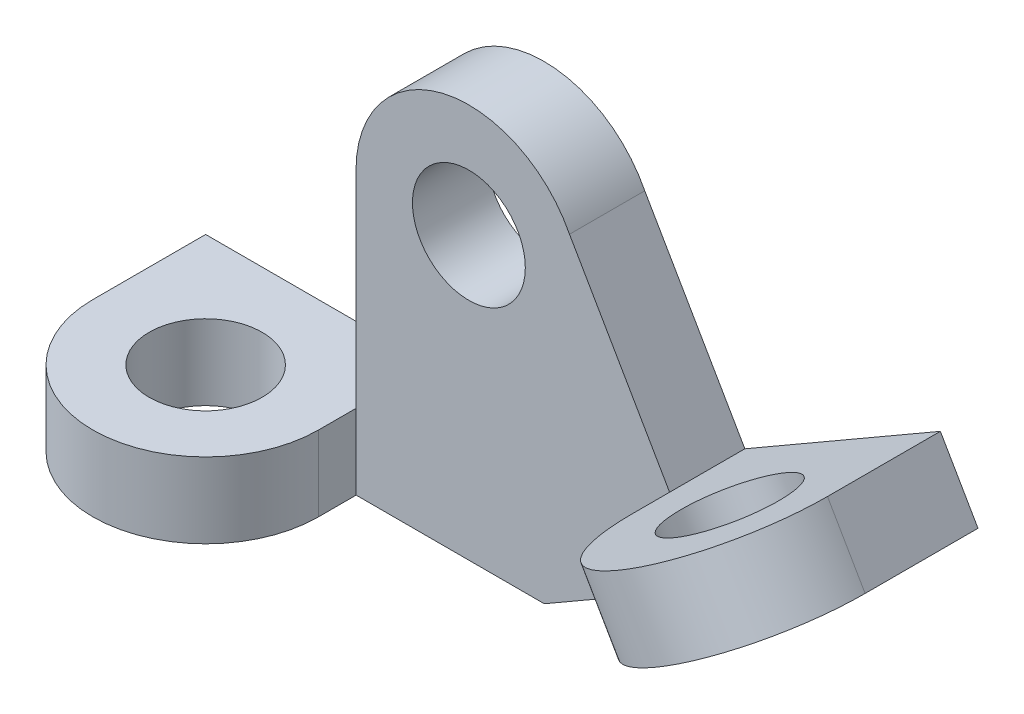
ISO-10303-21;
HEADER;
FILE_DESCRIPTION(('STEP AP214'),'2;1');
FILE_NAME('part.step','',(''),(''),'','','');
FILE_SCHEMA(('AUTOMOTIVE_DESIGN { 1 0 10303 214 1 1 1 1 }'));
ENDSEC;
DATA;
#1=APPLICATION_CONTEXT('core data for automotive mechanical design processes');
#2=APPLICATION_PROTOCOL_DEFINITION('international standard','automotive_design',2000,#1);
#3=PRODUCT_CONTEXT('',#1,'mechanical');
#4=PRODUCT('Part','Part','',(#3));
#5=PRODUCT_RELATED_PRODUCT_CATEGORY('part','',(#4));
#6=PRODUCT_DEFINITION_FORMATION('','',#4);
#7=PRODUCT_DEFINITION_CONTEXT('part definition',#1,'design');
#8=PRODUCT_DEFINITION('design','',#6,#7);
#9=PRODUCT_DEFINITION_SHAPE('','',#8);
#10=(LENGTH_UNIT() NAMED_UNIT(*) SI_UNIT(.MILLI.,.METRE.));
#11=(NAMED_UNIT(*) PLANE_ANGLE_UNIT() SI_UNIT($,.RADIAN.));
#12=(NAMED_UNIT(*) SI_UNIT($,.STERADIAN.) SOLID_ANGLE_UNIT());
#13=UNCERTAINTY_MEASURE_WITH_UNIT(LENGTH_MEASURE(1.E-05),#10,'distance_accuracy_value','');
#14=(GEOMETRIC_REPRESENTATION_CONTEXT(3) GLOBAL_UNCERTAINTY_ASSIGNED_CONTEXT((#13)) GLOBAL_UNIT_ASSIGNED_CONTEXT((#10,
#11,#12)) REPRESENTATION_CONTEXT('',''));
#15=CARTESIAN_POINT('',(0.,0.,0.));
#16=DIRECTION('',(0.,0.,1.));
#17=DIRECTION('',(1.,0.,0.));
#18=AXIS2_PLACEMENT_3D('',#15,#16,#17);
#19=CARTESIAN_POINT('',(75.,0.,75.));
#20=DIRECTION('',(0.,1.,0.));
#21=DIRECTION('',(0.,0.,1.));
#22=AXIS2_PLACEMENT_3D('',#19,#20,#21);
#23=CYLINDRICAL_SURFACE('',#22,75.);
#24=DIRECTION('',(0.,1.,0.));
#25=VECTOR('',#24,1.);
#26=CARTESIAN_POINT('',(0.,0.,75.));
#27=LINE('',#26,#25);
#28=CARTESIAN_POINT('',(0.,0.,75.));
#29=VERTEX_POINT('',#28);
#30=CARTESIAN_POINT('',(0.,50.,75.));
#31=VERTEX_POINT('',#30);
#32=EDGE_CURVE('E227',#29,#31,#27,.T.);
#33=ORIENTED_EDGE('',*,*,#32,.F.);
#34=CARTESIAN_POINT('',(75.,0.,75.));
#35=DIRECTION('',(0.,1.,0.));
#36=DIRECTION('',(0.,0.,1.));
#37=AXIS2_PLACEMENT_3D('',#34,#35,#36);
#38=CIRCLE('',#37,75.);
#39=CARTESIAN_POINT('',(150.,0.,75.));
#40=VERTEX_POINT('',#39);
#41=EDGE_CURVE('E43',#40,#29,#38,.F.);
#42=ORIENTED_EDGE('',*,*,#41,.F.);
#43=DIRECTION('',(0.,-1.,0.));
#44=VECTOR('',#43,1.);
#45=CARTESIAN_POINT('',(150.,0.,75.));
#46=LINE('',#45,#44);
#47=CARTESIAN_POINT('',(150.,50.,75.));
#48=VERTEX_POINT('',#47);
#49=EDGE_CURVE('E230',#48,#40,#46,.T.);
#50=ORIENTED_EDGE('',*,*,#49,.F.);
#51=CARTESIAN_POINT('',(75.,50.,75.));
#52=DIRECTION('',(0.,1.,0.));
#53=DIRECTION('',(0.,0.,1.));
#54=AXIS2_PLACEMENT_3D('',#51,#52,#53);
#55=CIRCLE('',#54,75.);
#56=EDGE_CURVE('E11',#31,#48,#55,.T.);
#57=ORIENTED_EDGE('',*,*,#56,.F.);
#58=EDGE_LOOP('',(#33,#42,#50,#57));
#59=FACE_BOUND('',#58,.T.);
#60=ADVANCED_FACE('F35',(#59),#23,.T.);
#61=CARTESIAN_POINT('',(423.205080756888,143.301270189222,75.0000000000001));
#62=DIRECTION('',(-0.500000000000002,0.866025403784438,0.));
#63=DIRECTION('',(-0.866025403784438,-0.500000000000002,0.));
#64=AXIS2_PLACEMENT_3D('',#61,#62,#63);
#65=CYLINDRICAL_SURFACE('',#64,74.9999999999999);
#66=DIRECTION('',(0.500000000000002,-0.866025403784438,0.));
#67=VECTOR('',#66,1.);
#68=CARTESIAN_POINT('',(488.15698604072,180.801270189222,75.0000000000001));
#69=LINE('',#68,#67);
#70=CARTESIAN_POINT('',(488.15698604072,180.801270189222,75.0000000000001));
#71=VERTEX_POINT('',#70);
#72=CARTESIAN_POINT('',(513.15698604072,137.5,75.));
#73=VERTEX_POINT('',#72);
#74=EDGE_CURVE('E219',#71,#73,#69,.T.);
#75=ORIENTED_EDGE('',*,*,#74,.F.);
#76=CARTESIAN_POINT('',(423.205080756888,143.301270189222,75.0000000000001));
#77=DIRECTION('',(0.500000000000001,-0.866025403784438,0.));
#78=DIRECTION('',(0.866025403784438,0.500000000000001,0.));
#79=AXIS2_PLACEMENT_3D('',#76,#77,#78);
#80=CIRCLE('',#79,74.9999999999999);
#81=CARTESIAN_POINT('',(358.253175473055,105.801270189222,75.0000000000001));
#82=VERTEX_POINT('',#81);
#83=EDGE_CURVE('E127',#82,#71,#80,.F.);
#84=ORIENTED_EDGE('',*,*,#83,.F.);
#85=DIRECTION('',(-0.5,0.866025403784439,0.));
#86=VECTOR('',#85,1.);
#87=CARTESIAN_POINT('',(314.503175473055,181.57849302036,75.0000000000001));
#88=LINE('',#87,#86);
#89=CARTESIAN_POINT('',(383.253175473055,62.5000000000002,75.));
#90=VERTEX_POINT('',#89);
#91=EDGE_CURVE('E221',#90,#82,#88,.T.);
#92=ORIENTED_EDGE('',*,*,#91,.F.);
#93=CARTESIAN_POINT('',(448.205080756888,100.,75.0000000000001));
#94=DIRECTION('',(-0.500000000000001,0.866025403784438,0.));
#95=DIRECTION('',(-0.866025403784438,-0.500000000000001,0.));
#96=AXIS2_PLACEMENT_3D('',#93,#94,#95);
#97=CIRCLE('',#96,74.9999999999999);
#98=EDGE_CURVE('E225',#73,#90,#97,.F.);
#99=ORIENTED_EDGE('',*,*,#98,.F.);
#100=EDGE_LOOP('',(#75,#84,#92,#99));
#101=FACE_BOUND('',#100,.T.);
#102=ADVANCED_FACE('F269',(#101),#65,.T.);
#103=CARTESIAN_POINT('',(314.503175473054,181.578493020361,50.));
#104=DIRECTION('',(-0.866025403784438,-0.500000000000002,0.));
#105=DIRECTION('',(0.500000000000002,-0.866025403784438,0.));
#106=AXIS2_PLACEMENT_3D('',#103,#104,#105);
#107=PLANE('',#106);
#108=DIRECTION('',(0.,0.,-1.));
#109=VECTOR('',#108,1.);
#110=CARTESIAN_POINT('',(358.253175473055,105.801270189222,150.));
#111=LINE('',#110,#109);
#112=CARTESIAN_POINT('',(358.253175473055,105.801270189222,50.));
#113=VERTEX_POINT('',#112);
#114=CARTESIAN_POINT('',(358.253175473055,105.801270189222,0.));
#115=VERTEX_POINT('',#114);
#116=EDGE_CURVE('E160',#113,#115,#111,.T.);
#117=ORIENTED_EDGE('',*,*,#116,.T.);
#118=DIRECTION('',(-0.500000000000002,0.866025403784438,0.));
#119=VECTOR('',#118,1.);
#120=CARTESIAN_POINT('',(314.503175473054,181.578493020361,0.));
#121=LINE('',#120,#119);
#122=CARTESIAN_POINT('',(291.750893274647,220.986601776148,0.));
#123=VERTEX_POINT('',#122);
#124=EDGE_CURVE('E144',#115,#123,#121,.T.);
#125=ORIENTED_EDGE('',*,*,#124,.T.);
#126=DIRECTION('',(0.,0.,-1.));
#127=VECTOR('',#126,1.);
#128=CARTESIAN_POINT('',(291.750893274647,220.986601776148,50.));
#129=LINE('',#128,#127);
#130=CARTESIAN_POINT('',(291.750893274647,220.986601776148,50.));
#131=VERTEX_POINT('',#130);
#132=EDGE_CURVE('E201',#131,#123,#129,.T.);
#133=ORIENTED_EDGE('',*,*,#132,.F.);
#134=DIRECTION('',(-0.500000000000002,0.866025403784438,0.));
#135=VECTOR('',#134,1.);
#136=CARTESIAN_POINT('',(314.503175473054,181.578493020361,50.));
#137=LINE('',#136,#135);
#138=EDGE_CURVE('E165',#113,#131,#137,.T.);
#139=ORIENTED_EDGE('',*,*,#138,.F.);
#140=EDGE_LOOP('',(#117,#125,#133,#139));
#141=FACE_BOUND('',#140,.T.);
#142=ADVANCED_FACE('F273',(#141),#107,.F.);
#143=CARTESIAN_POINT('',(0.,0.,150.));
#144=DIRECTION('',(0.,1.,0.));
#145=DIRECTION('',(0.,0.,1.));
#146=AXIS2_PLACEMENT_3D('',#143,#144,#145);
#147=PLANE('',#146);
#148=CARTESIAN_POINT('',(75.,0.,75.0000000000003));
#149=DIRECTION('',(0.,1.,0.));
#150=DIRECTION('',(0.,0.,1.));
#151=AXIS2_PLACEMENT_3D('',#148,#149,#150);
#152=CIRCLE('',#151,37.5);
#153=CARTESIAN_POINT('',(75.,0.,112.5));
#154=VERTEX_POINT('',#153);
#155=EDGE_CURVE('E150',#154,#154,#152,.T.);
#156=ORIENTED_EDGE('',*,*,#155,.T.);
#157=EDGE_LOOP('',(#156));
#158=FACE_BOUND('',#157,.T.);
#159=DIRECTION('',(0.,0.,-1.));
#160=VECTOR('',#159,1.);
#161=CARTESIAN_POINT('',(150.,0.,150.));
#162=LINE('',#161,#160);
#163=CARTESIAN_POINT('',(150.,0.,50.));
#164=VERTEX_POINT('',#163);
#165=EDGE_CURVE('E217',#40,#164,#162,.T.);
#166=ORIENTED_EDGE('',*,*,#165,.F.);
#167=ORIENTED_EDGE('',*,*,#41,.T.);
#168=DIRECTION('',(0.,0.,-1.));
#169=VECTOR('',#168,1.);
#170=CARTESIAN_POINT('',(0.,0.,150.));
#171=LINE('',#170,#169);
#172=CARTESIAN_POINT('',(0.,0.,0.));
#173=VERTEX_POINT('',#172);
#174=EDGE_CURVE('E211',#29,#173,#171,.T.);
#175=ORIENTED_EDGE('',*,*,#174,.T.);
#176=DIRECTION('',(1.,0.,0.));
#177=VECTOR('',#176,1.);
#178=CARTESIAN_POINT('',(0.,0.,0.));
#179=LINE('',#178,#177);
#180=CARTESIAN_POINT('',(275.,0.,0.));
#181=VERTEX_POINT('',#180);
#182=EDGE_CURVE('E204',#173,#181,#179,.T.);
#183=ORIENTED_EDGE('',*,*,#182,.T.);
#184=DIRECTION('',(0.,0.,-1.));
#185=VECTOR('',#184,1.);
#186=CARTESIAN_POINT('',(275.,0.,50.));
#187=LINE('',#186,#185);
#188=CARTESIAN_POINT('',(275.,0.,50.));
#189=VERTEX_POINT('',#188);
#190=EDGE_CURVE('E183',#189,#181,#187,.T.);
#191=ORIENTED_EDGE('',*,*,#190,.F.);
#192=DIRECTION('',(1.,0.,0.));
#193=VECTOR('',#192,1.);
#194=CARTESIAN_POINT('',(0.,0.,50.));
#195=LINE('',#194,#193);
#196=EDGE_CURVE('E178',#164,#189,#195,.T.);
#197=ORIENTED_EDGE('',*,*,#196,.F.);
#198=EDGE_LOOP('',(#166,#167,#175,#183,#191,#197));
#199=FACE_BOUND('',#198,.T.);
#200=ADVANCED_FACE('F233',(#158,#199),#147,.F.);
#201=CARTESIAN_POINT('',(150.,0.,150.));
#202=DIRECTION('',(-1.,0.,0.));
#203=DIRECTION('',(0.,0.,1.));
#204=AXIS2_PLACEMENT_3D('',#201,#202,#203);
#205=PLANE('',#204);
#206=DIRECTION('',(0.,0.,-1.));
#207=VECTOR('',#206,1.);
#208=CARTESIAN_POINT('',(150.,50.,150.));
#209=LINE('',#208,#207);
#210=CARTESIAN_POINT('',(150.,50.,50.));
#211=VERTEX_POINT('',#210);
#212=EDGE_CURVE('E215',#48,#211,#209,.T.);
#213=ORIENTED_EDGE('',*,*,#212,.F.);
#214=ORIENTED_EDGE('',*,*,#49,.T.);
#215=ORIENTED_EDGE('',*,*,#165,.T.);
#216=DIRECTION('',(0.,1.,0.));
#217=VECTOR('',#216,1.);
#218=CARTESIAN_POINT('',(150.,0.,50.));
#219=LINE('',#218,#217);
#220=EDGE_CURVE('E175',#164,#211,#219,.T.);
#221=ORIENTED_EDGE('',*,*,#220,.T.);
#222=EDGE_LOOP('',(#213,#214,#215,#221));
#223=FACE_BOUND('',#222,.T.);
#224=ADVANCED_FACE('F253',(#223),#205,.F.);
#225=CARTESIAN_POINT('',(0.,50.,150.));
#226=DIRECTION('',(0.,1.,0.));
#227=DIRECTION('',(0.,0.,1.));
#228=AXIS2_PLACEMENT_3D('',#225,#226,#227);
#229=PLANE('',#228);
#230=CARTESIAN_POINT('',(75.,50.,75.0000000000003));
#231=DIRECTION('',(0.,1.,0.));
#232=DIRECTION('',(0.,0.,1.));
#233=AXIS2_PLACEMENT_3D('',#230,#231,#232);
#234=CIRCLE('',#233,37.5);
#235=CARTESIAN_POINT('',(75.,50.,112.5));
#236=VERTEX_POINT('',#235);
#237=EDGE_CURVE('E153',#236,#236,#234,.T.);
#238=ORIENTED_EDGE('',*,*,#237,.F.);
#239=EDGE_LOOP('',(#238));
#240=FACE_BOUND('',#239,.T.);
#241=DIRECTION('',(0.,0.,-1.));
#242=VECTOR('',#241,1.);
#243=CARTESIAN_POINT('',(0.,50.,150.));
#244=LINE('',#243,#242);
#245=CARTESIAN_POINT('',(0.,50.,0.));
#246=VERTEX_POINT('',#245);
#247=EDGE_CURVE('E213',#31,#246,#244,.T.);
#248=ORIENTED_EDGE('',*,*,#247,.F.);
#249=ORIENTED_EDGE('',*,*,#56,.T.);
#250=ORIENTED_EDGE('',*,*,#212,.T.);
#251=DIRECTION('',(0.,0.,-1.));
#252=VECTOR('',#251,1.);
#253=CARTESIAN_POINT('',(150.,50.,50.));
#254=LINE('',#253,#252);
#255=CARTESIAN_POINT('',(150.,50.,0.));
#256=VERTEX_POINT('',#255);
#257=EDGE_CURVE('E196',#211,#256,#254,.T.);
#258=ORIENTED_EDGE('',*,*,#257,.T.);
#259=DIRECTION('',(1.,0.,0.));
#260=VECTOR('',#259,1.);
#261=CARTESIAN_POINT('',(0.,50.,0.));
#262=LINE('',#261,#260);
#263=EDGE_CURVE('E206',#246,#256,#262,.T.);
#264=ORIENTED_EDGE('',*,*,#263,.F.);
#265=EDGE_LOOP('',(#248,#249,#250,#258,#264));
#266=FACE_BOUND('',#265,.T.);
#267=ADVANCED_FACE('F257',(#240,#266),#229,.T.);
#268=CARTESIAN_POINT('',(0.,0.,150.));
#269=DIRECTION('',(-1.,0.,0.));
#270=DIRECTION('',(0.,0.,1.));
#271=AXIS2_PLACEMENT_3D('',#268,#269,#270);
#272=PLANE('',#271);
#273=ORIENTED_EDGE('',*,*,#174,.F.);
#274=ORIENTED_EDGE('',*,*,#32,.T.);
#275=ORIENTED_EDGE('',*,*,#247,.T.);
#276=DIRECTION('',(0.,1.,0.));
#277=VECTOR('',#276,1.);
#278=CARTESIAN_POINT('',(0.,0.,0.));
#279=LINE('',#278,#277);
#280=EDGE_CURVE('E208',#173,#246,#279,.T.);
#281=ORIENTED_EDGE('',*,*,#280,.F.);
#282=EDGE_LOOP('',(#273,#274,#275,#281));
#283=FACE_BOUND('',#282,.T.);
#284=ADVANCED_FACE('F238',(#283),#272,.T.);
#285=CARTESIAN_POINT('',(0.,0.,0.));
#286=DIRECTION('',(0.,0.,1.));
#287=DIRECTION('',(1.,0.,0.));
#288=AXIS2_PLACEMENT_3D('',#285,#286,#287);
#289=PLANE('',#288);
#290=ORIENTED_EDGE('',*,*,#182,.F.);
#291=ORIENTED_EDGE('',*,*,#280,.T.);
#292=ORIENTED_EDGE('',*,*,#263,.T.);
#293=DIRECTION('',(-0.00077736461636763,0.999999697852081,0.));
#294=VECTOR('',#293,1.);
#295=CARTESIAN_POINT('',(150.038777574712,0.116634872010618,0.));
#296=LINE('',#295,#294);
#297=CARTESIAN_POINT('',(149.893501015379,187.,0.));
#298=VERTEX_POINT('',#297);
#299=EDGE_CURVE('E190',#256,#298,#296,.T.);
#300=ORIENTED_EDGE('',*,*,#299,.T.);
#301=CARTESIAN_POINT('',(224.893501015379,187.,0.));
#302=DIRECTION('',(0.,0.,1.));
#303=DIRECTION('',(1.,0.,0.));
#304=AXIS2_PLACEMENT_3D('',#301,#302,#303);
#305=CIRCLE('',#304,75.);
#306=EDGE_CURVE('E187',#123,#298,#305,.T.);
#307=ORIENTED_EDGE('',*,*,#306,.F.);
#308=ORIENTED_EDGE('',*,*,#124,.F.);
#309=DIRECTION('',(-0.866025403784438,-0.500000000000001,0.));
#310=VECTOR('',#309,1.);
#311=CARTESIAN_POINT('',(43.7500000000002,-75.7772228311385,0.));
#312=LINE('',#311,#310);
#313=CARTESIAN_POINT('',(488.15698604072,180.801270189222,0.));
#314=VERTEX_POINT('',#313);
#315=EDGE_CURVE('E125',#314,#115,#312,.T.);
#316=ORIENTED_EDGE('',*,*,#315,.F.);
#317=DIRECTION('',(-0.500000000000002,0.866025403784438,0.));
#318=VECTOR('',#317,1.);
#319=CARTESIAN_POINT('',(444.40698604072,256.578493020361,0.));
#320=LINE('',#319,#318);
#321=CARTESIAN_POINT('',(513.15698604072,137.5,0.));
#322=VERTEX_POINT('',#321);
#323=EDGE_CURVE('E142',#322,#314,#320,.T.);
#324=ORIENTED_EDGE('',*,*,#323,.F.);
#325=DIRECTION('',(0.866025403784438,0.500000000000001,0.));
#326=VECTOR('',#325,1.);
#327=CARTESIAN_POINT('',(68.7500000000004,-119.078493020361,0.));
#328=LINE('',#327,#326);
#329=EDGE_CURVE('E166',#181,#322,#328,.T.);
#330=ORIENTED_EDGE('',*,*,#329,.F.);
#331=EDGE_LOOP('',(#290,#291,#292,#300,#307,#308,#316,#324,#330));
#332=FACE_BOUND('',#331,.T.);
#333=CARTESIAN_POINT('',(224.893501015379,187.,0.));
#334=DIRECTION('',(0.,0.,1.));
#335=DIRECTION('',(1.,0.,0.));
#336=AXIS2_PLACEMENT_3D('',#333,#334,#335);
#337=CIRCLE('',#336,37.5);
#338=CARTESIAN_POINT('',(262.393501015379,187.,0.));
#339=VERTEX_POINT('',#338);
#340=EDGE_CURVE('E132',#339,#339,#337,.T.);
#341=ORIENTED_EDGE('',*,*,#340,.T.);
#342=EDGE_LOOP('',(#341));
#343=FACE_BOUND('',#342,.T.);
#344=ADVANCED_FACE('F139',(#332,#343),#289,.F.);
#345=CARTESIAN_POINT('',(224.893501015379,187.,50.));
#346=DIRECTION('',(0.,0.,-1.));
#347=DIRECTION('',(-1.,0.,0.));
#348=AXIS2_PLACEMENT_3D('',#345,#346,#347);
#349=CYLINDRICAL_SURFACE('',#348,75.);
#350=ORIENTED_EDGE('',*,*,#306,.T.);
#351=DIRECTION('',(0.,0.,-1.));
#352=VECTOR('',#351,1.);
#353=CARTESIAN_POINT('',(149.893501015379,187.,50.));
#354=LINE('',#353,#352);
#355=CARTESIAN_POINT('',(149.893501015379,187.,50.));
#356=VERTEX_POINT('',#355);
#357=EDGE_CURVE('E199',#356,#298,#354,.T.);
#358=ORIENTED_EDGE('',*,*,#357,.F.);
#359=CARTESIAN_POINT('',(224.893501015379,187.,50.));
#360=DIRECTION('',(0.,0.,1.));
#361=DIRECTION('',(1.,0.,0.));
#362=AXIS2_PLACEMENT_3D('',#359,#360,#361);
#363=CIRCLE('',#362,75.);
#364=EDGE_CURVE('E170',#131,#356,#363,.T.);
#365=ORIENTED_EDGE('',*,*,#364,.F.);
#366=ORIENTED_EDGE('',*,*,#132,.T.);
#367=EDGE_LOOP('',(#350,#358,#365,#366));
#368=FACE_BOUND('',#367,.T.);
#369=ADVANCED_FACE('F327',(#368),#349,.T.);
#370=CARTESIAN_POINT('',(150.038777574712,0.116634872010618,50.));
#371=DIRECTION('',(-0.999999697852081,-0.00077736461636763,0.));
#372=DIRECTION('',(0.00077736461636763,-0.999999697852081,0.));
#373=AXIS2_PLACEMENT_3D('',#370,#371,#372);
#374=PLANE('',#373);
#375=ORIENTED_EDGE('',*,*,#299,.F.);
#376=ORIENTED_EDGE('',*,*,#257,.F.);
#377=DIRECTION('',(-0.00077736461636763,0.999999697852081,0.));
#378=VECTOR('',#377,1.);
#379=CARTESIAN_POINT('',(150.038777574712,0.116634872010618,50.));
#380=LINE('',#379,#378);
#381=EDGE_CURVE('E172',#211,#356,#380,.T.);
#382=ORIENTED_EDGE('',*,*,#381,.T.);
#383=ORIENTED_EDGE('',*,*,#357,.T.);
#384=EDGE_LOOP('',(#375,#376,#382,#383));
#385=FACE_BOUND('',#384,.T.);
#386=ADVANCED_FACE('F256',(#385),#374,.T.);
#387=CARTESIAN_POINT('',(224.893501015379,187.,50.));
#388=DIRECTION('',(0.,0.,-1.));
#389=DIRECTION('',(-1.,0.,0.));
#390=AXIS2_PLACEMENT_3D('',#387,#388,#389);
#391=CYLINDRICAL_SURFACE('',#390,37.5);
#392=CARTESIAN_POINT('',(224.893501015379,187.,50.));
#393=DIRECTION('',(0.,0.,1.));
#394=DIRECTION('',(1.,0.,0.));
#395=AXIS2_PLACEMENT_3D('',#392,#393,#394);
#396=CIRCLE('',#395,37.5);
#397=CARTESIAN_POINT('',(262.393501015379,187.,50.));
#398=VERTEX_POINT('',#397);
#399=EDGE_CURVE('E162',#398,#398,#396,.T.);
#400=ORIENTED_EDGE('',*,*,#399,.T.);
#401=EDGE_LOOP('',(#400));
#402=FACE_BOUND('',#401,.T.);
#403=ORIENTED_EDGE('',*,*,#340,.F.);
#404=EDGE_LOOP('',(#403));
#405=FACE_BOUND('',#404,.T.);
#406=ADVANCED_FACE('F324',(#402,#405),#391,.F.);
#407=CARTESIAN_POINT('',(68.7500000000004,-119.078493020361,50.));
#408=DIRECTION('',(-0.500000000000001,0.866025403784438,0.));
#409=DIRECTION('',(-0.866025403784438,-0.500000000000001,0.));
#410=AXIS2_PLACEMENT_3D('',#407,#408,#409);
#411=PLANE('',#410);
#412=CARTESIAN_POINT('',(448.205080756888,100.,75.0000000000003));
#413=DIRECTION('',(-0.500000000000001,0.866025403784438,0.));
#414=DIRECTION('',(-0.866025403784438,-0.500000000000001,0.));
#415=AXIS2_PLACEMENT_3D('',#412,#413,#414);
#416=CIRCLE('',#415,37.4999999999999);
#417=CARTESIAN_POINT('',(415.729128114971,81.2500000000003,75.0000000000003));
#418=VERTEX_POINT('',#417);
#419=EDGE_CURVE('E297',#418,#418,#416,.T.);
#420=ORIENTED_EDGE('',*,*,#419,.T.);
#421=EDGE_LOOP('',(#420));
#422=FACE_BOUND('',#421,.T.);
#423=DIRECTION('',(0.,0.,-1.));
#424=VECTOR('',#423,1.);
#425=CARTESIAN_POINT('',(513.15698604072,137.5,150.));
#426=LINE('',#425,#424);
#427=EDGE_CURVE('E145',#73,#322,#426,.T.);
#428=ORIENTED_EDGE('',*,*,#427,.F.);
#429=ORIENTED_EDGE('',*,*,#98,.T.);
#430=DIRECTION('',(0.,0.,-1.));
#431=VECTOR('',#430,1.);
#432=CARTESIAN_POINT('',(383.253175473055,62.5000000000002,150.));
#433=LINE('',#432,#431);
#434=CARTESIAN_POINT('',(383.253175473055,62.5000000000002,50.));
#435=VERTEX_POINT('',#434);
#436=EDGE_CURVE('E158',#90,#435,#433,.T.);
#437=ORIENTED_EDGE('',*,*,#436,.T.);
#438=DIRECTION('',(0.866025403784438,0.500000000000001,0.));
#439=VECTOR('',#438,1.);
#440=CARTESIAN_POINT('',(68.7500000000004,-119.078493020361,50.));
#441=LINE('',#440,#439);
#442=EDGE_CURVE('E180',#189,#435,#441,.T.);
#443=ORIENTED_EDGE('',*,*,#442,.F.);
#444=ORIENTED_EDGE('',*,*,#190,.T.);
#445=ORIENTED_EDGE('',*,*,#329,.T.);
#446=EDGE_LOOP('',(#428,#429,#437,#443,#444,#445));
#447=FACE_BOUND('',#446,.T.);
#448=ADVANCED_FACE('F243',(#422,#447),#411,.F.);
#449=CARTESIAN_POINT('',(0.,0.,50.));
#450=DIRECTION('',(0.,0.,1.));
#451=DIRECTION('',(1.,0.,0.));
#452=AXIS2_PLACEMENT_3D('',#449,#450,#451);
#453=PLANE('',#452);
#454=ORIENTED_EDGE('',*,*,#399,.F.);
#455=EDGE_LOOP('',(#454));
#456=FACE_BOUND('',#455,.T.);
#457=EDGE_CURVE('E167',#435,#113,#137,.T.);
#458=ORIENTED_EDGE('',*,*,#457,.T.);
#459=ORIENTED_EDGE('',*,*,#138,.T.);
#460=ORIENTED_EDGE('',*,*,#364,.T.);
#461=ORIENTED_EDGE('',*,*,#381,.F.);
#462=ORIENTED_EDGE('',*,*,#220,.F.);
#463=ORIENTED_EDGE('',*,*,#196,.T.);
#464=ORIENTED_EDGE('',*,*,#442,.T.);
#465=EDGE_LOOP('',(#458,#459,#460,#461,#462,#463,#464));
#466=FACE_BOUND('',#465,.T.);
#467=ADVANCED_FACE('F247',(#456,#466),#453,.T.);
#468=CARTESIAN_POINT('',(444.40698604072,256.578493020361,150.));
#469=DIRECTION('',(-0.866025403784438,-0.500000000000002,0.));
#470=DIRECTION('',(0.500000000000002,-0.866025403784438,0.));
#471=AXIS2_PLACEMENT_3D('',#468,#469,#470);
#472=PLANE('',#471);
#473=DIRECTION('',(0.,0.,-1.));
#474=VECTOR('',#473,1.);
#475=CARTESIAN_POINT('',(488.15698604072,180.801270189222,150.));
#476=LINE('',#475,#474);
#477=EDGE_CURVE('E120',#71,#314,#476,.T.);
#478=ORIENTED_EDGE('',*,*,#477,.F.);
#479=ORIENTED_EDGE('',*,*,#74,.T.);
#480=ORIENTED_EDGE('',*,*,#427,.T.);
#481=ORIENTED_EDGE('',*,*,#323,.T.);
#482=EDGE_LOOP('',(#478,#479,#480,#481));
#483=FACE_BOUND('',#482,.T.);
#484=ADVANCED_FACE('F147',(#483),#472,.F.);
#485=CARTESIAN_POINT('',(43.7500000000002,-75.7772228311385,150.));
#486=DIRECTION('',(0.500000000000001,-0.866025403784438,0.));
#487=DIRECTION('',(0.866025403784438,0.500000000000001,0.));
#488=AXIS2_PLACEMENT_3D('',#485,#486,#487);
#489=PLANE('',#488);
#490=CARTESIAN_POINT('',(423.205080756888,143.301270189222,75.0000000000003));
#491=DIRECTION('',(-0.500000000000001,0.866025403784438,0.));
#492=DIRECTION('',(-0.866025403784438,-0.500000000000001,0.));
#493=AXIS2_PLACEMENT_3D('',#490,#491,#492);
#494=CIRCLE('',#493,37.4999999999999);
#495=CARTESIAN_POINT('',(390.729128114971,124.551270189222,75.0000000000003));
#496=VERTEX_POINT('',#495);
#497=EDGE_CURVE('E299',#496,#496,#494,.T.);
#498=ORIENTED_EDGE('',*,*,#497,.F.);
#499=EDGE_LOOP('',(#498));
#500=FACE_BOUND('',#499,.T.);
#501=EDGE_CURVE('E133',#82,#113,#111,.T.);
#502=ORIENTED_EDGE('',*,*,#501,.F.);
#503=ORIENTED_EDGE('',*,*,#83,.T.);
#504=ORIENTED_EDGE('',*,*,#477,.T.);
#505=ORIENTED_EDGE('',*,*,#315,.T.);
#506=ORIENTED_EDGE('',*,*,#116,.F.);
#507=EDGE_LOOP('',(#502,#503,#504,#505,#506));
#508=FACE_BOUND('',#507,.T.);
#509=ADVANCED_FACE('F123',(#500,#508),#489,.F.);
#510=CARTESIAN_POINT('',(314.503175473055,181.57849302036,150.));
#511=DIRECTION('',(-0.866025403784439,-0.5,0.));
#512=DIRECTION('',(0.5,-0.866025403784439,0.));
#513=AXIS2_PLACEMENT_3D('',#510,#511,#512);
#514=PLANE('',#513);
#515=ORIENTED_EDGE('',*,*,#436,.F.);
#516=ORIENTED_EDGE('',*,*,#91,.T.);
#517=ORIENTED_EDGE('',*,*,#501,.T.);
#518=ORIENTED_EDGE('',*,*,#457,.F.);
#519=EDGE_LOOP('',(#515,#516,#517,#518));
#520=FACE_BOUND('',#519,.T.);
#521=ADVANCED_FACE('F294',(#520),#514,.T.);
#522=CARTESIAN_POINT('',(75.,0.,75.0000000000003));
#523=DIRECTION('',(0.,1.,0.));
#524=DIRECTION('',(0.,0.,1.));
#525=AXIS2_PLACEMENT_3D('',#522,#523,#524);
#526=CYLINDRICAL_SURFACE('',#525,37.5);
#527=ORIENTED_EDGE('',*,*,#155,.F.);
#528=EDGE_LOOP('',(#527));
#529=FACE_BOUND('',#528,.T.);
#530=ORIENTED_EDGE('',*,*,#237,.T.);
#531=EDGE_LOOP('',(#530));
#532=FACE_BOUND('',#531,.T.);
#533=ADVANCED_FACE('F290',(#529,#532),#526,.F.);
#534=CARTESIAN_POINT('',(507.744327267068,-3.12499999999991,75.0000000000003));
#535=DIRECTION('',(-0.500000000000001,0.866025403784438,0.));
#536=DIRECTION('',(-0.866025403784438,-0.500000000000001,0.));
#537=AXIS2_PLACEMENT_3D('',#534,#535,#536);
#538=CYLINDRICAL_SURFACE('',#537,37.4999999999999);
#539=ORIENTED_EDGE('',*,*,#497,.T.);
#540=EDGE_LOOP('',(#539));
#541=FACE_BOUND('',#540,.T.);
#542=ORIENTED_EDGE('',*,*,#419,.F.);
#543=EDGE_LOOP('',(#542));
#544=FACE_BOUND('',#543,.T.);
#545=ADVANCED_FACE('F293',(#541,#544),#538,.F.);
#546=CLOSED_SHELL('',(#60,#102,#142,#200,#224,#267,#284,#344,#369,#386,#406,#448,#467,#484,#509,
#521,#533,#545));
#547=MANIFOLD_SOLID_BREP('B2',#546);
#548=ADVANCED_BREP_SHAPE_REPRESENTATION('',(#18,#547),#14);
#549=SHAPE_DEFINITION_REPRESENTATION(#9,#548);
ENDSEC;
END-ISO-10303-21;
